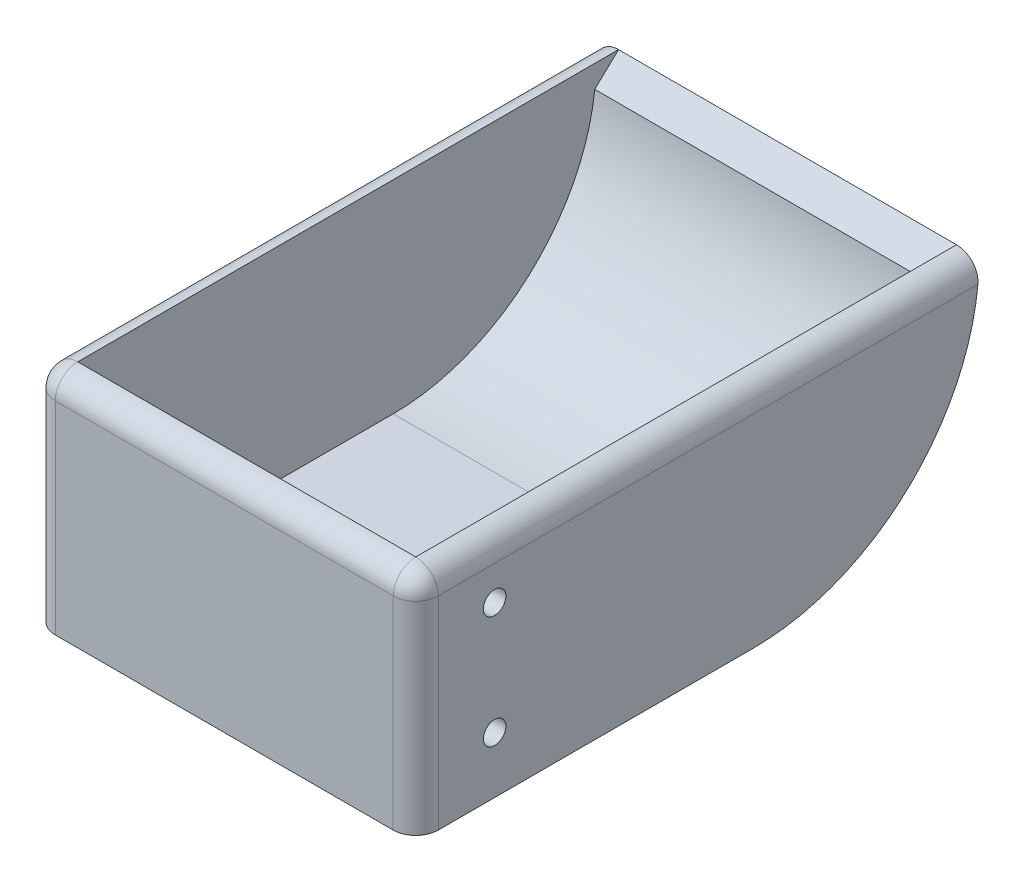
ISO-10303-21;
HEADER;
FILE_DESCRIPTION(('STEP AP214'),'2;1');
FILE_NAME('part.step','',(''),(''),'','','');
FILE_SCHEMA(('AUTOMOTIVE_DESIGN { 1 0 10303 214 1 1 1 1 }'));
ENDSEC;
DATA;
#1=APPLICATION_CONTEXT('core data for automotive mechanical design processes');
#2=APPLICATION_PROTOCOL_DEFINITION('international standard','automotive_design',2000,#1);
#3=PRODUCT_CONTEXT('',#1,'mechanical');
#4=PRODUCT('Part','Part','',(#3));
#5=PRODUCT_RELATED_PRODUCT_CATEGORY('part','',(#4));
#6=PRODUCT_DEFINITION_FORMATION('','',#4);
#7=PRODUCT_DEFINITION_CONTEXT('part definition',#1,'design');
#8=PRODUCT_DEFINITION('design','',#6,#7);
#9=PRODUCT_DEFINITION_SHAPE('','',#8);
#10=(LENGTH_UNIT() NAMED_UNIT(*) SI_UNIT(.MILLI.,.METRE.));
#11=(NAMED_UNIT(*) PLANE_ANGLE_UNIT() SI_UNIT($,.RADIAN.));
#12=(NAMED_UNIT(*) SI_UNIT($,.STERADIAN.) SOLID_ANGLE_UNIT());
#13=UNCERTAINTY_MEASURE_WITH_UNIT(LENGTH_MEASURE(1.E-05),#10,'distance_accuracy_value','');
#14=(GEOMETRIC_REPRESENTATION_CONTEXT(3) GLOBAL_UNCERTAINTY_ASSIGNED_CONTEXT((#13)) GLOBAL_UNIT_ASSIGNED_CONTEXT((#10,
#11,#12)) REPRESENTATION_CONTEXT('',''));
#15=CARTESIAN_POINT('',(0.,0.,0.));
#16=DIRECTION('',(0.,0.,1.));
#17=DIRECTION('',(1.,0.,0.));
#18=AXIS2_PLACEMENT_3D('',#15,#16,#17);
#19=CARTESIAN_POINT('',(38.1,0.,25.4));
#20=DIRECTION('',(-1.,0.,0.));
#21=DIRECTION('',(0.,0.,1.));
#22=AXIS2_PLACEMENT_3D('',#19,#20,#21);
#23=CYLINDRICAL_SURFACE('',#22,25.4);
#24=CARTESIAN_POINT('',(-2.54,0.,25.4));
#25=DIRECTION('',(-1.,0.,0.));
#26=DIRECTION('',(0.,0.,1.));
#27=AXIS2_PLACEMENT_3D('',#24,#25,#26);
#28=CIRCLE('',#27,25.4);
#29=CARTESIAN_POINT('',(-2.54,-2.54,0.127319097491852));
#30=VERTEX_POINT('',#29);
#31=CARTESIAN_POINT('',(-2.54,-25.4,25.4));
#32=VERTEX_POINT('',#31);
#33=EDGE_CURVE('E117',#30,#32,#28,.T.);
#34=ORIENTED_EDGE('',*,*,#33,.F.);
#35=CARTESIAN_POINT('',(-2.54,-2.54,0.127319097491852));
#36=CARTESIAN_POINT('',(-2.5400069229816,-2.46895095482815,0.120175487921232));
#37=CARTESIAN_POINT('',(-2.53701890877588,-2.39787324397869,0.113337400255856));
#38=CARTESIAN_POINT('',(-2.52509065860921,-2.25616111412924,0.100301155232049));
#39=CARTESIAN_POINT('',(-2.51615051440391,-2.18552668831268,0.0941029880105605));
#40=CARTESIAN_POINT('',(-2.49236378683833,-2.04524748839153,0.0823792564046294));
#41=CARTESIAN_POINT('',(-2.47752124480106,-1.97560207084405,0.076853235181069));
#42=CARTESIAN_POINT('',(-2.44203820477459,-1.83777453534126,0.066477323776503));
#43=CARTESIAN_POINT('',(-2.42139783781241,-1.76959238435456,0.0616274183194315));
#44=CARTESIAN_POINT('',(-2.35092280548287,-1.56788577617733,0.0480806314364476));
#45=CARTESIAN_POINT('',(-2.29252841375934,-1.4371670996254,0.0403838721376695));
#46=CARTESIAN_POINT('',(-2.15462459018218,-1.18738382799099,0.0274593381749562));
#47=CARTESIAN_POINT('',(-2.07511995639418,-1.06831659310249,0.0222310032215837));
#48=CARTESIAN_POINT('',(-1.89744866558808,-0.845439774049764,0.0138296637789007));
#49=CARTESIAN_POINT('',(-1.79933148508081,-0.741591004355452,0.0106513063591801));
#50=CARTESIAN_POINT('',(-1.58705559504564,-0.55175050227971,0.00581526238476942));
#51=CARTESIAN_POINT('',(-1.47289343831536,-0.465762617104836,0.00415790318846953));
#52=CARTESIAN_POINT('',(-1.23163033503062,-0.314010503753329,0.00182715465812816));
#53=CARTESIAN_POINT('',(-1.10451249143239,-0.248273147747507,0.00115506836266288));
#54=CARTESIAN_POINT('',(-0.8410801846932,-0.139065649386077,0.000321639767004279));
#55=CARTESIAN_POINT('',(-0.704770930743126,-0.0955830123328505,0.000160010611401787));
#56=CARTESIAN_POINT('',(-0.47306396436272,-0.0426233689579577,2.69013072608647E-05));
#57=CARTESIAN_POINT('',(-0.379099019608538,-0.0266502725492466,1.01223969081634E-05));
#58=CARTESIAN_POINT('',(-0.190102336478283,-0.00533924831224802,-5.24919404199919E-08));
#59=CARTESIAN_POINT('',(-0.0950722474042858,1.33110930852059E-05,6.51932510134467E-06));
#60=CARTESIAN_POINT('',(0.,0.,0.));
#61=B_SPLINE_CURVE_WITH_KNOTS('',3,(#35,#36,#37,#38,#39,#40,#41,#42,#43,#44,#45,#46,#47,#48,#49,
#50,#51,#52,#53,#54,#55,#56,#57,#58,#59,#60),.UNSPECIFIED.,.F.,.F.,(4,2,2,2,2,2,2,2,2,2,2,2,4),
(0.,0.214154563435615,0.428305825626388,0.642310711982133,0.856310762357167,1.2842081753672,
1.71200841634886,2.13868700768439,2.56545740983191,2.9927917148193,3.41988583315955,
3.70526355127827,3.99024783983065),.UNSPECIFIED.);
#62=CARTESIAN_POINT('',(0.,0.,0.));
#63=VERTEX_POINT('',#62);
#64=EDGE_CURVE('E213',#30,#63,#61,.T.);
#65=ORIENTED_EDGE('',*,*,#64,.T.);
#66=DIRECTION('',(-1.,0.,0.));
#67=VECTOR('',#66,1.);
#68=CARTESIAN_POINT('',(38.1,0.,0.));
#69=LINE('',#68,#67);
#70=CARTESIAN_POINT('',(38.1,0.,0.));
#71=VERTEX_POINT('',#70);
#72=EDGE_CURVE('E175',#71,#63,#69,.T.);
#73=ORIENTED_EDGE('',*,*,#72,.F.);
#74=CARTESIAN_POINT('',(38.1,0.,0.));
#75=CARTESIAN_POINT('',(38.1714345454082,6.84184496170879E-06,2.24444189986524E-06));
#76=CARTESIAN_POINT('',(38.2428658457466,-0.003013496005712,5.85949259414711E-08));
#77=CARTESIAN_POINT('',(38.3852174972289,-0.0150555826655881,3.15482401854794E-06));
#78=CARTESIAN_POINT('',(38.4561378725046,-0.0240770461295312,8.4365450259414E-06));
#79=CARTESIAN_POINT('',(38.5969181247486,-0.0480595902613454,4.27808386323055E-05));
#80=CARTESIAN_POINT('',(38.6667787458877,-0.0630162816484289,7.18258543705294E-05));
#81=CARTESIAN_POINT('',(38.8049747603369,-0.098747955476039,0.000185730573029523));
#82=CARTESIAN_POINT('',(38.8733101722663,-0.119522866847906,0.000270589594207898));
#83=CARTESIAN_POINT('',(39.0753700226828,-0.190407371928706,0.000669001118583034));
#84=CARTESIAN_POINT('',(39.2062045937266,-0.24908641603895,0.00112634123313368));
#85=CARTESIAN_POINT('',(39.4560669804041,-0.387534387280416,0.00286285117821984));
#86=CARTESIAN_POINT('',(39.5750968522892,-0.467299632518173,0.00414187758857757));
#87=CARTESIAN_POINT('',(39.7980383699821,-0.645634338864051,0.00805074707281622));
#88=CARTESIAN_POINT('',(39.9019564636508,-0.744195738331744,0.0106800118470867));
#89=CARTESIAN_POINT('',(40.0917687950058,-0.957335871602082,0.0178241447801091));
#90=CARTESIAN_POINT('',(40.1776602629876,-1.07191706226922,0.022339302379042));
#91=CARTESIAN_POINT('',(40.3288498516073,-1.31357543865308,0.0337011989062642));
#92=CARTESIAN_POINT('',(40.3941800859861,-1.44063272708525,0.0405442668265694));
#93=CARTESIAN_POINT('',(40.5025930454475,-1.70372211539293,0.0568617883781719));
#94=CARTESIAN_POINT('',(40.5456872575666,-1.83974954028866,0.0663348794522837));
#95=CARTESIAN_POINT('',(40.598023822831,-2.07048567145336,0.0843591795516234));
#96=CARTESIAN_POINT('',(40.6137639955006,-2.16383267398352,0.0921628833967696));
#97=CARTESIAN_POINT('',(40.63475114003,-2.35145951815212,0.108902975906957));
#98=CARTESIAN_POINT('',(40.6400134089208,-2.44573779765429,0.117837693055414));
#99=CARTESIAN_POINT('',(40.64,-2.53999999999999,0.127319097491851));
#100=B_SPLINE_CURVE_WITH_KNOTS('',3,(#74,#75,#76,#77,#78,#79,#80,#81,#82,#83,#84,#85,#86,#87,
#88,#89,#90,#91,#92,#93,#94,#95,#96,#97,#98,#99),.UNSPECIFIED.,.F.,.F.,(4,2,2,2,2,2,2,2,2,2,2,2,
4),(0.,0.214233953834333,0.428457721867222,0.642523359299101,0.856586382066275,1.2845425720544,
1.71242408526685,2.14012249184696,2.56788656420443,2.99497917536822,3.42185093081597,
3.70625545651401,3.9902444655036),.UNSPECIFIED.);
#101=CARTESIAN_POINT('',(40.64,-2.54,0.127319097491724));
#102=VERTEX_POINT('',#101);
#103=EDGE_CURVE('E207',#71,#102,#100,.T.);
#104=ORIENTED_EDGE('',*,*,#103,.T.);
#105=CARTESIAN_POINT('',(40.64,0.,25.3999999999997));
#106=DIRECTION('',(1.,0.,0.));
#107=DIRECTION('',(0.,0.,-1.));
#108=AXIS2_PLACEMENT_3D('',#105,#106,#107);
#109=CIRCLE('',#108,25.3999999999999);
#110=CARTESIAN_POINT('',(40.64,-25.3999999999999,25.3999999999997));
#111=VERTEX_POINT('',#110);
#112=EDGE_CURVE('E131',#111,#102,#109,.T.);
#113=ORIENTED_EDGE('',*,*,#112,.F.);
#114=DIRECTION('',(-1.,0.,0.));
#115=VECTOR('',#114,1.);
#116=CARTESIAN_POINT('',(38.1,-25.4,25.4));
#117=LINE('',#116,#115);
#118=EDGE_CURVE('E129',#111,#32,#117,.T.);
#119=ORIENTED_EDGE('',*,*,#118,.T.);
#120=EDGE_LOOP('',(#34,#65,#73,#104,#113,#119));
#121=FACE_BOUND('',#120,.T.);
#122=ADVANCED_FACE('F35',(#121),#23,.T.);
#123=CARTESIAN_POINT('',(38.1,-2.54,2.68154934860214));
#124=DIRECTION('',(0.,-0.726008801798653,-0.687685407516318));
#125=DIRECTION('',(0.,0.687685407516318,-0.726008801798653));
#126=AXIS2_PLACEMENT_3D('',#123,#124,#125);
#127=PLANE('',#126);
#128=DIRECTION('',(0.,-0.687685407516318,0.726008801798653));
#129=VECTOR('',#128,1.);
#130=CARTESIAN_POINT('',(0.,-2.54,2.68154934860214));
#131=LINE('',#130,#129);
#132=CARTESIAN_POINT('',(0.,-2.54,2.68154934860214));
#133=VERTEX_POINT('',#132);
#134=EDGE_CURVE('E155',#63,#133,#131,.T.);
#135=ORIENTED_EDGE('',*,*,#134,.T.);
#136=DIRECTION('',(-1.,0.,0.));
#137=VECTOR('',#136,1.);
#138=CARTESIAN_POINT('',(38.1,-2.54,2.68154934860214));
#139=LINE('',#138,#137);
#140=CARTESIAN_POINT('',(38.1,-2.54,2.68154934860214));
#141=VERTEX_POINT('',#140);
#142=EDGE_CURVE('E197',#141,#133,#139,.T.);
#143=ORIENTED_EDGE('',*,*,#142,.F.);
#144=DIRECTION('',(0.,-0.687685407516318,0.726008801798653));
#145=VECTOR('',#144,1.);
#146=CARTESIAN_POINT('',(38.1,-2.54,2.68154934860214));
#147=LINE('',#146,#145);
#148=EDGE_CURVE('E158',#71,#141,#147,.T.);
#149=ORIENTED_EDGE('',*,*,#148,.F.);
#150=ORIENTED_EDGE('',*,*,#72,.T.);
#151=EDGE_LOOP('',(#135,#143,#149,#150));
#152=FACE_BOUND('',#151,.T.);
#153=ADVANCED_FACE('F227',(#152),#127,.F.);
#154=CARTESIAN_POINT('',(38.1,0.,25.4));
#155=DIRECTION('',(-1.,0.,0.));
#156=DIRECTION('',(0.,0.,1.));
#157=AXIS2_PLACEMENT_3D('',#154,#155,#156);
#158=CYLINDRICAL_SURFACE('',#157,22.86);
#159=CARTESIAN_POINT('',(0.,0.,25.4));
#160=DIRECTION('',(-1.,0.,0.));
#161=DIRECTION('',(0.,0.,-1.));
#162=AXIS2_PLACEMENT_3D('',#159,#160,#161);
#163=CIRCLE('',#162,22.86);
#164=CARTESIAN_POINT('',(0.,-22.86,25.4));
#165=VERTEX_POINT('',#164);
#166=EDGE_CURVE('E277',#133,#165,#163,.T.);
#167=ORIENTED_EDGE('',*,*,#166,.T.);
#168=DIRECTION('',(-1.,0.,0.));
#169=VECTOR('',#168,1.);
#170=CARTESIAN_POINT('',(38.1,-22.86,25.4));
#171=LINE('',#170,#169);
#172=CARTESIAN_POINT('',(38.1,-22.86,25.4));
#173=VERTEX_POINT('',#172);
#174=EDGE_CURVE('E195',#173,#165,#171,.T.);
#175=ORIENTED_EDGE('',*,*,#174,.F.);
#176=CARTESIAN_POINT('',(38.1,0.,25.4));
#177=DIRECTION('',(-1.,0.,0.));
#178=DIRECTION('',(0.,0.,-1.));
#179=AXIS2_PLACEMENT_3D('',#176,#177,#178);
#180=CIRCLE('',#179,22.86);
#181=EDGE_CURVE('E161',#141,#173,#180,.T.);
#182=ORIENTED_EDGE('',*,*,#181,.F.);
#183=ORIENTED_EDGE('',*,*,#142,.T.);
#184=EDGE_LOOP('',(#167,#175,#182,#183));
#185=FACE_BOUND('',#184,.T.);
#186=ADVANCED_FACE('F278',(#185),#158,.F.);
#187=CARTESIAN_POINT('',(38.1,-22.86,60.96));
#188=DIRECTION('',(0.,-1.,0.));
#189=DIRECTION('',(0.,0.,-1.));
#190=AXIS2_PLACEMENT_3D('',#187,#188,#189);
#191=PLANE('',#190);
#192=DIRECTION('',(0.,0.,1.));
#193=VECTOR('',#192,1.);
#194=CARTESIAN_POINT('',(0.,-22.86,60.96));
#195=LINE('',#194,#193);
#196=CARTESIAN_POINT('',(0.,-22.86,60.96));
#197=VERTEX_POINT('',#196);
#198=EDGE_CURVE('E186',#165,#197,#195,.T.);
#199=ORIENTED_EDGE('',*,*,#198,.T.);
#200=DIRECTION('',(-1.,0.,0.));
#201=VECTOR('',#200,1.);
#202=CARTESIAN_POINT('',(38.1,-22.86,60.96));
#203=LINE('',#202,#201);
#204=CARTESIAN_POINT('',(38.1,-22.86,60.96));
#205=VERTEX_POINT('',#204);
#206=EDGE_CURVE('E180',#205,#197,#203,.T.);
#207=ORIENTED_EDGE('',*,*,#206,.F.);
#208=DIRECTION('',(0.,0.,1.));
#209=VECTOR('',#208,1.);
#210=CARTESIAN_POINT('',(38.1,-22.86,60.96));
#211=LINE('',#210,#209);
#212=EDGE_CURVE('E165',#173,#205,#211,.T.);
#213=ORIENTED_EDGE('',*,*,#212,.F.);
#214=ORIENTED_EDGE('',*,*,#174,.T.);
#215=EDGE_LOOP('',(#199,#207,#213,#214));
#216=FACE_BOUND('',#215,.T.);
#217=ADVANCED_FACE('F276',(#216),#191,.F.);
#218=CARTESIAN_POINT('',(38.1,0.,60.96));
#219=DIRECTION('',(0.,0.,1.));
#220=DIRECTION('',(1.,0.,0.));
#221=AXIS2_PLACEMENT_3D('',#218,#219,#220);
#222=PLANE('',#221);
#223=DIRECTION('',(0.,1.,0.));
#224=VECTOR('',#223,1.);
#225=CARTESIAN_POINT('',(0.,0.,60.96));
#226=LINE('',#225,#224);
#227=CARTESIAN_POINT('',(0.,0.,60.96));
#228=VERTEX_POINT('',#227);
#229=EDGE_CURVE('E162',#197,#228,#226,.T.);
#230=ORIENTED_EDGE('',*,*,#229,.T.);
#231=DIRECTION('',(-1.,0.,0.));
#232=VECTOR('',#231,1.);
#233=CARTESIAN_POINT('',(38.1,0.,60.96));
#234=LINE('',#233,#232);
#235=CARTESIAN_POINT('',(38.1,0.,60.96));
#236=VERTEX_POINT('',#235);
#237=EDGE_CURVE('E177',#236,#228,#234,.T.);
#238=ORIENTED_EDGE('',*,*,#237,.F.);
#239=DIRECTION('',(0.,1.,0.));
#240=VECTOR('',#239,1.);
#241=CARTESIAN_POINT('',(38.1,0.,60.96));
#242=LINE('',#241,#240);
#243=EDGE_CURVE('E135',#205,#236,#242,.T.);
#244=ORIENTED_EDGE('',*,*,#243,.F.);
#245=ORIENTED_EDGE('',*,*,#206,.T.);
#246=EDGE_LOOP('',(#230,#238,#244,#245));
#247=FACE_BOUND('',#246,.T.);
#248=ADVANCED_FACE('F272',(#247),#222,.F.);
#249=CARTESIAN_POINT('',(38.1,0.,63.5));
#250=DIRECTION('',(0.,0.,-1.));
#251=DIRECTION('',(-1.,0.,0.));
#252=AXIS2_PLACEMENT_3D('',#249,#250,#251);
#253=PLANE('',#252);
#254=DIRECTION('',(-1.,0.,0.));
#255=VECTOR('',#254,1.);
#256=CARTESIAN_POINT('',(38.1,-25.4,63.5));
#257=LINE('',#256,#255);
#258=CARTESIAN_POINT('',(38.1,-25.4,63.5));
#259=VERTEX_POINT('',#258);
#260=CARTESIAN_POINT('',(0.,-25.4,63.5));
#261=VERTEX_POINT('',#260);
#262=EDGE_CURVE('E134',#259,#261,#257,.T.);
#263=ORIENTED_EDGE('',*,*,#262,.F.);
#264=DIRECTION('',(0.,-1.,0.));
#265=VECTOR('',#264,1.);
#266=CARTESIAN_POINT('',(38.1,-2.54,63.5));
#267=LINE('',#266,#265);
#268=CARTESIAN_POINT('',(38.1,-2.54,63.5));
#269=VERTEX_POINT('',#268);
#270=EDGE_CURVE('E287',#259,#269,#267,.F.);
#271=ORIENTED_EDGE('',*,*,#270,.T.);
#272=DIRECTION('',(-1.,0.,0.));
#273=VECTOR('',#272,1.);
#274=CARTESIAN_POINT('',(38.1,-2.54,63.5));
#275=LINE('',#274,#273);
#276=CARTESIAN_POINT('',(0.,-2.54,63.5));
#277=VERTEX_POINT('',#276);
#278=EDGE_CURVE('E59',#269,#277,#275,.T.);
#279=ORIENTED_EDGE('',*,*,#278,.T.);
#280=DIRECTION('',(0.,1.,0.));
#281=VECTOR('',#280,1.);
#282=CARTESIAN_POINT('',(0.,-25.4,63.5));
#283=LINE('',#282,#281);
#284=EDGE_CURVE('E290',#277,#261,#283,.F.);
#285=ORIENTED_EDGE('',*,*,#284,.T.);
#286=EDGE_LOOP('',(#263,#271,#279,#285));
#287=FACE_BOUND('',#286,.T.);
#288=ADVANCED_FACE('F312',(#287),#253,.F.);
#289=CARTESIAN_POINT('',(38.1,-25.4,63.5));
#290=DIRECTION('',(0.,1.,0.));
#291=DIRECTION('',(0.,0.,1.));
#292=AXIS2_PLACEMENT_3D('',#289,#290,#291);
#293=PLANE('',#292);
#294=DIRECTION('',(0.,0.,-1.));
#295=VECTOR('',#294,1.);
#296=CARTESIAN_POINT('',(40.64,-25.4,63.5));
#297=LINE('',#296,#295);
#298=CARTESIAN_POINT('',(40.64,-25.4,60.96));
#299=VERTEX_POINT('',#298);
#300=EDGE_CURVE('E144',#299,#111,#297,.T.);
#301=ORIENTED_EDGE('',*,*,#300,.F.);
#302=CARTESIAN_POINT('',(38.1,-25.4,60.96));
#303=DIRECTION('',(0.,1.,0.));
#304=DIRECTION('',(0.,0.,1.));
#305=AXIS2_PLACEMENT_3D('',#302,#303,#304);
#306=CIRCLE('',#305,2.54);
#307=EDGE_CURVE('E308',#299,#259,#306,.F.);
#308=ORIENTED_EDGE('',*,*,#307,.T.);
#309=ORIENTED_EDGE('',*,*,#262,.T.);
#310=CARTESIAN_POINT('',(0.,-25.4,60.96));
#311=DIRECTION('',(0.,1.,0.));
#312=DIRECTION('',(0.,0.,1.));
#313=AXIS2_PLACEMENT_3D('',#310,#311,#312);
#314=CIRCLE('',#313,2.54);
#315=CARTESIAN_POINT('',(-2.54,-25.4,60.96));
#316=VERTEX_POINT('',#315);
#317=EDGE_CURVE('E140',#261,#316,#314,.F.);
#318=ORIENTED_EDGE('',*,*,#317,.T.);
#319=DIRECTION('',(0.,0.,1.));
#320=VECTOR('',#319,1.);
#321=CARTESIAN_POINT('',(-2.54,-25.4,0.));
#322=LINE('',#321,#320);
#323=EDGE_CURVE('E121',#32,#316,#322,.T.);
#324=ORIENTED_EDGE('',*,*,#323,.F.);
#325=ORIENTED_EDGE('',*,*,#118,.F.);
#326=EDGE_LOOP('',(#301,#308,#309,#318,#324,#325));
#327=FACE_BOUND('',#326,.T.);
#328=ADVANCED_FACE('F137',(#327),#293,.F.);
#329=CARTESIAN_POINT('',(38.1,0.,25.3999999999997));
#330=DIRECTION('',(1.,0.,0.));
#331=DIRECTION('',(0.,0.,-1.));
#332=AXIS2_PLACEMENT_3D('',#329,#330,#331);
#333=PLANE('',#332);
#334=CARTESIAN_POINT('',(38.1,-19.05,54.61));
#335=DIRECTION('',(1.,0.,0.));
#336=DIRECTION('',(0.,0.,-1.));
#337=AXIS2_PLACEMENT_3D('',#334,#335,#336);
#338=CIRCLE('',#337,1.27);
#339=CARTESIAN_POINT('',(38.1,-19.05,53.34));
#340=VERTEX_POINT('',#339);
#341=EDGE_CURVE('E425',#340,#340,#338,.T.);
#342=ORIENTED_EDGE('',*,*,#341,.T.);
#343=EDGE_LOOP('',(#342));
#344=FACE_BOUND('',#343,.T.);
#345=CARTESIAN_POINT('',(38.1,-6.35,54.61));
#346=DIRECTION('',(1.,0.,0.));
#347=DIRECTION('',(0.,0.,-1.));
#348=AXIS2_PLACEMENT_3D('',#345,#346,#347);
#349=CIRCLE('',#348,1.27);
#350=CARTESIAN_POINT('',(38.1,-6.35,53.34));
#351=VERTEX_POINT('',#350);
#352=EDGE_CURVE('E302',#351,#351,#349,.T.);
#353=ORIENTED_EDGE('',*,*,#352,.T.);
#354=EDGE_LOOP('',(#353));
#355=FACE_BOUND('',#354,.T.);
#356=DIRECTION('',(0.,0.,1.));
#357=VECTOR('',#356,1.);
#358=CARTESIAN_POINT('',(38.1,0.,63.5));
#359=LINE('',#358,#357);
#360=EDGE_CURVE('E141',#71,#236,#359,.T.);
#361=ORIENTED_EDGE('',*,*,#360,.F.);
#362=ORIENTED_EDGE('',*,*,#148,.T.);
#363=ORIENTED_EDGE('',*,*,#181,.T.);
#364=ORIENTED_EDGE('',*,*,#212,.T.);
#365=ORIENTED_EDGE('',*,*,#243,.T.);
#366=EDGE_LOOP('',(#361,#362,#363,#364,#365));
#367=FACE_BOUND('',#366,.T.);
#368=ADVANCED_FACE('F281',(#344,#355,#367),#333,.F.);
#369=CARTESIAN_POINT('',(40.64,0.,25.3999999999997));
#370=DIRECTION('',(1.,0.,0.));
#371=DIRECTION('',(0.,0.,-1.));
#372=AXIS2_PLACEMENT_3D('',#369,#370,#371);
#373=PLANE('',#372);
#374=CARTESIAN_POINT('',(40.64,-19.05,54.61));
#375=DIRECTION('',(1.,0.,0.));
#376=DIRECTION('',(0.,0.,-1.));
#377=AXIS2_PLACEMENT_3D('',#374,#375,#376);
#378=CIRCLE('',#377,1.27);
#379=CARTESIAN_POINT('',(40.64,-19.05,53.34));
#380=VERTEX_POINT('',#379);
#381=EDGE_CURVE('E427',#380,#380,#378,.T.);
#382=ORIENTED_EDGE('',*,*,#381,.F.);
#383=EDGE_LOOP('',(#382));
#384=FACE_BOUND('',#383,.T.);
#385=CARTESIAN_POINT('',(40.64,-6.35,54.61));
#386=DIRECTION('',(1.,0.,0.));
#387=DIRECTION('',(0.,0.,-1.));
#388=AXIS2_PLACEMENT_3D('',#385,#386,#387);
#389=CIRCLE('',#388,1.27);
#390=CARTESIAN_POINT('',(40.64,-6.35,53.34));
#391=VERTEX_POINT('',#390);
#392=EDGE_CURVE('E429',#391,#391,#389,.T.);
#393=ORIENTED_EDGE('',*,*,#392,.F.);
#394=EDGE_LOOP('',(#393));
#395=FACE_BOUND('',#394,.T.);
#396=DIRECTION('',(0.,0.,1.));
#397=VECTOR('',#396,1.);
#398=CARTESIAN_POINT('',(40.64,-2.54,63.5));
#399=LINE('',#398,#397);
#400=CARTESIAN_POINT('',(40.64,-2.54,60.96));
#401=VERTEX_POINT('',#400);
#402=EDGE_CURVE('E187',#102,#401,#399,.T.);
#403=ORIENTED_EDGE('',*,*,#402,.T.);
#404=DIRECTION('',(0.,-1.,0.));
#405=VECTOR('',#404,1.);
#406=CARTESIAN_POINT('',(40.64,-25.4,60.96));
#407=LINE('',#406,#405);
#408=EDGE_CURVE('E234',#401,#299,#407,.T.);
#409=ORIENTED_EDGE('',*,*,#408,.T.);
#410=ORIENTED_EDGE('',*,*,#300,.T.);
#411=ORIENTED_EDGE('',*,*,#112,.T.);
#412=EDGE_LOOP('',(#403,#409,#410,#411));
#413=FACE_BOUND('',#412,.T.);
#414=ADVANCED_FACE('F313',(#384,#395,#413),#373,.T.);
#415=CARTESIAN_POINT('',(-2.54,0.,0.));
#416=DIRECTION('',(-1.,0.,0.));
#417=DIRECTION('',(0.,0.,1.));
#418=AXIS2_PLACEMENT_3D('',#415,#416,#417);
#419=PLANE('',#418);
#420=ORIENTED_EDGE('',*,*,#323,.T.);
#421=DIRECTION('',(0.,1.,0.));
#422=VECTOR('',#421,1.);
#423=CARTESIAN_POINT('',(-2.54,-2.54,60.96));
#424=LINE('',#423,#422);
#425=CARTESIAN_POINT('',(-2.54,-2.54,60.96));
#426=VERTEX_POINT('',#425);
#427=EDGE_CURVE('E44',#316,#426,#424,.T.);
#428=ORIENTED_EDGE('',*,*,#427,.T.);
#429=DIRECTION('',(0.,0.,-1.));
#430=VECTOR('',#429,1.);
#431=CARTESIAN_POINT('',(-2.54,-2.54,0.));
#432=LINE('',#431,#430);
#433=EDGE_CURVE('E122',#426,#30,#432,.T.);
#434=ORIENTED_EDGE('',*,*,#433,.T.);
#435=ORIENTED_EDGE('',*,*,#33,.T.);
#436=EDGE_LOOP('',(#420,#428,#434,#435));
#437=FACE_BOUND('',#436,.T.);
#438=ADVANCED_FACE('F119',(#437),#419,.T.);
#439=CARTESIAN_POINT('',(0.,0.,0.));
#440=DIRECTION('',(-1.,0.,0.));
#441=DIRECTION('',(0.,0.,1.));
#442=AXIS2_PLACEMENT_3D('',#439,#440,#441);
#443=PLANE('',#442);
#444=ORIENTED_EDGE('',*,*,#229,.F.);
#445=ORIENTED_EDGE('',*,*,#198,.F.);
#446=ORIENTED_EDGE('',*,*,#166,.F.);
#447=ORIENTED_EDGE('',*,*,#134,.F.);
#448=DIRECTION('',(0.,0.,-1.));
#449=VECTOR('',#448,1.);
#450=CARTESIAN_POINT('',(0.,0.,0.));
#451=LINE('',#450,#449);
#452=EDGE_CURVE('E125',#228,#63,#451,.T.);
#453=ORIENTED_EDGE('',*,*,#452,.F.);
#454=EDGE_LOOP('',(#444,#445,#446,#447,#453));
#455=FACE_BOUND('',#454,.T.);
#456=ADVANCED_FACE('F269',(#455),#443,.F.);
#457=CARTESIAN_POINT('',(38.1,-2.54,25.3999999999997));
#458=DIRECTION('',(0.,0.,-1.));
#459=DIRECTION('',(-1.,0.,0.));
#460=AXIS2_PLACEMENT_3D('',#457,#458,#459);
#461=CYLINDRICAL_SURFACE('',#460,2.54);
#462=ORIENTED_EDGE('',*,*,#360,.T.);
#463=CARTESIAN_POINT('',(38.1,-2.54,60.96));
#464=DIRECTION('',(0.,0.,-1.));
#465=DIRECTION('',(-1.,0.,0.));
#466=AXIS2_PLACEMENT_3D('',#463,#464,#465);
#467=CIRCLE('',#466,2.54);
#468=EDGE_CURVE('E285',#236,#401,#467,.T.);
#469=ORIENTED_EDGE('',*,*,#468,.T.);
#470=ORIENTED_EDGE('',*,*,#402,.F.);
#471=ORIENTED_EDGE('',*,*,#103,.F.);
#472=EDGE_LOOP('',(#462,#469,#470,#471));
#473=FACE_BOUND('',#472,.T.);
#474=ADVANCED_FACE('F221',(#473),#461,.T.);
#475=CARTESIAN_POINT('',(0.,-2.54,0.));
#476=DIRECTION('',(0.,0.,1.));
#477=DIRECTION('',(1.,0.,0.));
#478=AXIS2_PLACEMENT_3D('',#475,#476,#477);
#479=CYLINDRICAL_SURFACE('',#478,2.54);
#480=ORIENTED_EDGE('',*,*,#433,.F.);
#481=CARTESIAN_POINT('',(0.,-2.54,60.96));
#482=DIRECTION('',(0.,0.,1.));
#483=DIRECTION('',(1.,0.,0.));
#484=AXIS2_PLACEMENT_3D('',#481,#482,#483);
#485=CIRCLE('',#484,2.54);
#486=EDGE_CURVE('E11',#426,#228,#485,.F.);
#487=ORIENTED_EDGE('',*,*,#486,.T.);
#488=ORIENTED_EDGE('',*,*,#452,.T.);
#489=ORIENTED_EDGE('',*,*,#64,.F.);
#490=EDGE_LOOP('',(#480,#487,#488,#489));
#491=FACE_BOUND('',#490,.T.);
#492=ADVANCED_FACE('F236',(#491),#479,.T.);
#493=CARTESIAN_POINT('',(0.,0.,60.96));
#494=DIRECTION('',(0.,-1.,0.));
#495=DIRECTION('',(0.,0.,-1.));
#496=AXIS2_PLACEMENT_3D('',#493,#494,#495);
#497=CYLINDRICAL_SURFACE('',#496,2.54);
#498=CARTESIAN_POINT('',(0.,-2.54,60.96));
#499=DIRECTION('',(0.,1.,0.));
#500=DIRECTION('',(0.,0.,1.));
#501=AXIS2_PLACEMENT_3D('',#498,#499,#500);
#502=CIRCLE('',#501,2.54);
#503=EDGE_CURVE('E152',#426,#277,#502,.T.);
#504=ORIENTED_EDGE('',*,*,#503,.F.);
#505=ORIENTED_EDGE('',*,*,#427,.F.);
#506=ORIENTED_EDGE('',*,*,#317,.F.);
#507=ORIENTED_EDGE('',*,*,#284,.F.);
#508=EDGE_LOOP('',(#504,#505,#506,#507));
#509=FACE_BOUND('',#508,.T.);
#510=ADVANCED_FACE('F37',(#509),#497,.T.);
#511=CARTESIAN_POINT('',(0.,-2.54,60.96));
#512=DIRECTION('',(0.,0.,1.));
#513=DIRECTION('',(1.,0.,0.));
#514=AXIS2_PLACEMENT_3D('',#511,#512,#513);
#515=SPHERICAL_SURFACE('',#514,2.54);
#516=ORIENTED_EDGE('',*,*,#486,.F.);
#517=ORIENTED_EDGE('',*,*,#503,.T.);
#518=CARTESIAN_POINT('',(0.,-2.54,60.96));
#519=DIRECTION('',(1.,0.,0.));
#520=DIRECTION('',(0.,1.,0.));
#521=AXIS2_PLACEMENT_3D('',#518,#519,#520);
#522=CIRCLE('',#521,2.54);
#523=EDGE_CURVE('E265',#228,#277,#522,.T.);
#524=ORIENTED_EDGE('',*,*,#523,.F.);
#525=EDGE_LOOP('',(#516,#517,#524));
#526=FACE_BOUND('',#525,.T.);
#527=ADVANCED_FACE('F252',(#526),#515,.T.);
#528=CARTESIAN_POINT('',(38.1,-2.54,60.96));
#529=DIRECTION('',(-1.,0.,0.));
#530=DIRECTION('',(0.,0.,1.));
#531=AXIS2_PLACEMENT_3D('',#528,#529,#530);
#532=CYLINDRICAL_SURFACE('',#531,2.54);
#533=CARTESIAN_POINT('',(38.1,-2.54,60.96));
#534=DIRECTION('',(1.,0.,0.));
#535=DIRECTION('',(0.,0.,-1.));
#536=AXIS2_PLACEMENT_3D('',#533,#534,#535);
#537=CIRCLE('',#536,2.54);
#538=EDGE_CURVE('E301',#236,#269,#537,.T.);
#539=ORIENTED_EDGE('',*,*,#538,.F.);
#540=ORIENTED_EDGE('',*,*,#237,.T.);
#541=ORIENTED_EDGE('',*,*,#523,.T.);
#542=ORIENTED_EDGE('',*,*,#278,.F.);
#543=EDGE_LOOP('',(#539,#540,#541,#542));
#544=FACE_BOUND('',#543,.T.);
#545=ADVANCED_FACE('F249',(#544),#532,.T.);
#546=CARTESIAN_POINT('',(38.1,-2.54,60.96));
#547=DIRECTION('',(0.,0.,1.));
#548=DIRECTION('',(1.,0.,0.));
#549=AXIS2_PLACEMENT_3D('',#546,#547,#548);
#550=SPHERICAL_SURFACE('',#549,2.54);
#551=ORIENTED_EDGE('',*,*,#468,.F.);
#552=ORIENTED_EDGE('',*,*,#538,.T.);
#553=CARTESIAN_POINT('',(38.1,-2.54,60.96));
#554=DIRECTION('',(0.,-1.,0.));
#555=DIRECTION('',(0.,0.,-1.));
#556=AXIS2_PLACEMENT_3D('',#553,#554,#555);
#557=CIRCLE('',#556,2.54);
#558=EDGE_CURVE('E298',#401,#269,#557,.T.);
#559=ORIENTED_EDGE('',*,*,#558,.F.);
#560=EDGE_LOOP('',(#551,#552,#559));
#561=FACE_BOUND('',#560,.T.);
#562=ADVANCED_FACE('F245',(#561),#550,.T.);
#563=CARTESIAN_POINT('',(38.1,0.,60.96));
#564=DIRECTION('',(0.,1.,0.));
#565=DIRECTION('',(0.,0.,1.));
#566=AXIS2_PLACEMENT_3D('',#563,#564,#565);
#567=CYLINDRICAL_SURFACE('',#566,2.54);
#568=ORIENTED_EDGE('',*,*,#558,.T.);
#569=ORIENTED_EDGE('',*,*,#270,.F.);
#570=ORIENTED_EDGE('',*,*,#307,.F.);
#571=ORIENTED_EDGE('',*,*,#408,.F.);
#572=EDGE_LOOP('',(#568,#569,#570,#571));
#573=FACE_BOUND('',#572,.T.);
#574=ADVANCED_FACE('F241',(#573),#567,.T.);
#575=CARTESIAN_POINT('',(38.1,-6.35,54.61));
#576=DIRECTION('',(1.,0.,0.));
#577=DIRECTION('',(0.,0.,-1.));
#578=AXIS2_PLACEMENT_3D('',#575,#576,#577);
#579=CYLINDRICAL_SURFACE('',#578,1.27);
#580=ORIENTED_EDGE('',*,*,#352,.F.);
#581=EDGE_LOOP('',(#580));
#582=FACE_BOUND('',#581,.T.);
#583=ORIENTED_EDGE('',*,*,#392,.T.);
#584=EDGE_LOOP('',(#583));
#585=FACE_BOUND('',#584,.T.);
#586=ADVANCED_FACE('F244',(#582,#585),#579,.F.);
#587=CARTESIAN_POINT('',(38.1,-19.05,54.61));
#588=DIRECTION('',(1.,0.,0.));
#589=DIRECTION('',(0.,0.,-1.));
#590=AXIS2_PLACEMENT_3D('',#587,#588,#589);
#591=CYLINDRICAL_SURFACE('',#590,1.27);
#592=ORIENTED_EDGE('',*,*,#341,.F.);
#593=EDGE_LOOP('',(#592));
#594=FACE_BOUND('',#593,.T.);
#595=ORIENTED_EDGE('',*,*,#381,.T.);
#596=EDGE_LOOP('',(#595));
#597=FACE_BOUND('',#596,.T.);
#598=ADVANCED_FACE('F407',(#594,#597),#591,.F.);
#599=CLOSED_SHELL('',(#122,#153,#186,#217,#248,#288,#328,#368,#414,#438,#456,#474,#492,#510,
#527,#545,#562,#574,#586,#598));
#600=MANIFOLD_SOLID_BREP('B2',#599);
#601=ADVANCED_BREP_SHAPE_REPRESENTATION('',(#18,#600),#14);
#602=SHAPE_DEFINITION_REPRESENTATION(#9,#601);
ENDSEC;
END-ISO-10303-21;
